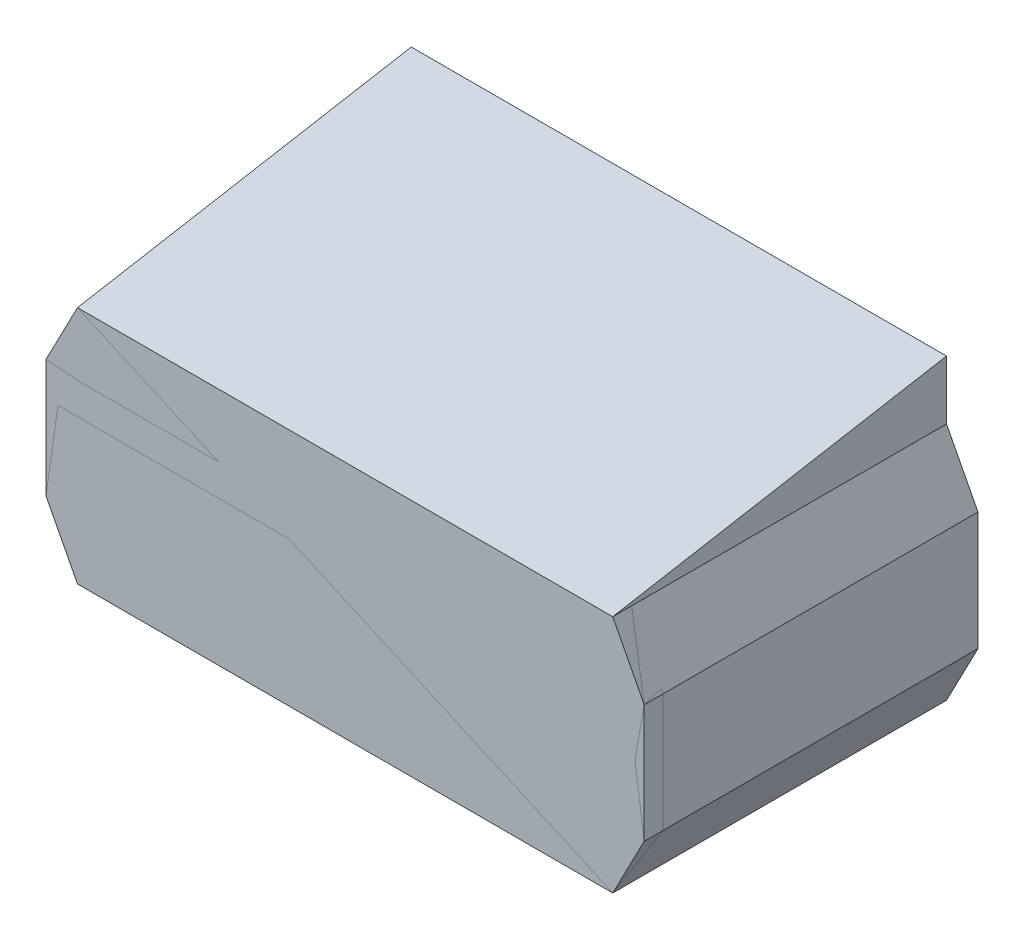
ISO-10303-21;
HEADER;
FILE_DESCRIPTION(('STEP AP214'),'2;1');
FILE_NAME('part.step','',(''),(''),'','','');
FILE_SCHEMA(('AUTOMOTIVE_DESIGN { 1 0 10303 214 1 1 1 1 }'));
ENDSEC;
DATA;
#1=APPLICATION_CONTEXT('core data for automotive mechanical design processes');
#2=APPLICATION_PROTOCOL_DEFINITION('international standard','automotive_design',2000,#1);
#3=PRODUCT_CONTEXT('',#1,'mechanical');
#4=PRODUCT('Part','Part','',(#3));
#5=PRODUCT_RELATED_PRODUCT_CATEGORY('part','',(#4));
#6=PRODUCT_DEFINITION_FORMATION('','',#4);
#7=PRODUCT_DEFINITION_CONTEXT('part definition',#1,'design');
#8=PRODUCT_DEFINITION('design','',#6,#7);
#9=PRODUCT_DEFINITION_SHAPE('','',#8);
#10=(LENGTH_UNIT() NAMED_UNIT(*) SI_UNIT(.MILLI.,.METRE.));
#11=(NAMED_UNIT(*) PLANE_ANGLE_UNIT() SI_UNIT($,.RADIAN.));
#12=(NAMED_UNIT(*) SI_UNIT($,.STERADIAN.) SOLID_ANGLE_UNIT());
#13=UNCERTAINTY_MEASURE_WITH_UNIT(LENGTH_MEASURE(1.E-05),#10,'distance_accuracy_value','');
#14=(GEOMETRIC_REPRESENTATION_CONTEXT(3) GLOBAL_UNCERTAINTY_ASSIGNED_CONTEXT((#13)) GLOBAL_UNIT_ASSIGNED_CONTEXT((#10,
#11,#12)) REPRESENTATION_CONTEXT('',''));
#15=CARTESIAN_POINT('',(0.,0.,0.));
#16=DIRECTION('',(0.,0.,1.));
#17=DIRECTION('',(1.,0.,0.));
#18=AXIS2_PLACEMENT_3D('',#15,#16,#17);
#19=CARTESIAN_POINT('',(-5.,9.60906334512409,-3.));
#20=DIRECTION('',(-1.,0.,0.));
#21=DIRECTION('',(0.,-1.,0.));
#22=AXIS2_PLACEMENT_3D('',#19,#20,#21);
#23=PLANE('',#22);
#24=DIRECTION('',(0.,-1.,0.));
#25=VECTOR('',#24,1.);
#26=CARTESIAN_POINT('',(-5.,9.60906334512409,0.));
#27=LINE('',#26,#25);
#28=CARTESIAN_POINT('',(-5.,28.3909366548759,0.));
#29=VERTEX_POINT('',#28);
#30=CARTESIAN_POINT('',(-5.,9.60906334512409,0.));
#31=VERTEX_POINT('',#30);
#32=EDGE_CURVE('E140',#29,#31,#27,.T.);
#33=ORIENTED_EDGE('',*,*,#32,.F.);
#34=DIRECTION('',(0.,0.,1.));
#35=VECTOR('',#34,1.);
#36=CARTESIAN_POINT('',(-5.,28.3909366548759,-3.));
#37=LINE('',#36,#35);
#38=CARTESIAN_POINT('',(-5.,28.3909366548759,-3.));
#39=VERTEX_POINT('',#38);
#40=EDGE_CURVE('E12',#39,#29,#37,.T.);
#41=ORIENTED_EDGE('',*,*,#40,.F.);
#42=DIRECTION('',(0.,-1.,0.));
#43=VECTOR('',#42,1.);
#44=CARTESIAN_POINT('',(-5.,9.60906334512409,-3.));
#45=LINE('',#44,#43);
#46=CARTESIAN_POINT('',(-5.,9.60906334512409,-3.));
#47=VERTEX_POINT('',#46);
#48=EDGE_CURVE('E160',#39,#47,#45,.T.);
#49=ORIENTED_EDGE('',*,*,#48,.T.);
#50=DIRECTION('',(0.,0.,1.));
#51=VECTOR('',#50,1.);
#52=CARTESIAN_POINT('',(-5.,9.60906334512409,-3.));
#53=LINE('',#52,#51);
#54=EDGE_CURVE('E46',#47,#31,#53,.T.);
#55=ORIENTED_EDGE('',*,*,#54,.T.);
#56=EDGE_LOOP('',(#33,#41,#49,#55));
#57=FACE_BOUND('',#56,.T.);
#58=ADVANCED_FACE('F43',(#57),#23,.T.);
#59=CARTESIAN_POINT('',(-5.,28.3909366548759,-3.));
#60=DIRECTION('',(-0.887092558542106,0.461591586339288,0.));
#61=DIRECTION('',(-0.461591586339288,-0.887092558542106,0.));
#62=AXIS2_PLACEMENT_3D('',#59,#60,#61);
#63=PLANE('',#62);
#64=DIRECTION('',(-0.461591586339288,-0.887092558542106,0.));
#65=VECTOR('',#64,1.);
#66=CARTESIAN_POINT('',(-5.,28.3909366548759,0.));
#67=LINE('',#66,#65);
#68=CARTESIAN_POINT('',(0.,38.,0.));
#69=VERTEX_POINT('',#68);
#70=EDGE_CURVE('E158',#69,#29,#67,.T.);
#71=ORIENTED_EDGE('',*,*,#70,.F.);
#72=DIRECTION('',(0.,0.,1.));
#73=VECTOR('',#72,1.);
#74=CARTESIAN_POINT('',(0.,38.,-3.));
#75=LINE('',#74,#73);
#76=CARTESIAN_POINT('',(0.,38.,-3.));
#77=VERTEX_POINT('',#76);
#78=EDGE_CURVE('E52',#77,#69,#75,.T.);
#79=ORIENTED_EDGE('',*,*,#78,.F.);
#80=DIRECTION('',(-0.461591586339288,-0.887092558542106,0.));
#81=VECTOR('',#80,1.);
#82=CARTESIAN_POINT('',(-5.,28.3909366548759,-3.));
#83=LINE('',#82,#81);
#84=EDGE_CURVE('E130',#77,#39,#83,.T.);
#85=ORIENTED_EDGE('',*,*,#84,.T.);
#86=ORIENTED_EDGE('',*,*,#40,.T.);
#87=EDGE_LOOP('',(#71,#79,#85,#86));
#88=FACE_BOUND('',#87,.T.);
#89=ADVANCED_FACE('F172',(#88),#63,.T.);
#90=CARTESIAN_POINT('',(0.,38.,-3.));
#91=DIRECTION('',(0.,1.,0.));
#92=DIRECTION('',(-1.,0.,0.));
#93=AXIS2_PLACEMENT_3D('',#90,#91,#92);
#94=PLANE('',#93);
#95=DIRECTION('',(-1.,0.,0.));
#96=VECTOR('',#95,1.);
#97=CARTESIAN_POINT('',(0.,38.,0.));
#98=LINE('',#97,#96);
#99=CARTESIAN_POINT('',(85.,38.,0.));
#100=VERTEX_POINT('',#99);
#101=EDGE_CURVE('E117',#100,#69,#98,.T.);
#102=ORIENTED_EDGE('',*,*,#101,.F.);
#103=DIRECTION('',(0.,0.,1.));
#104=VECTOR('',#103,1.);
#105=CARTESIAN_POINT('',(85.,38.,-3.));
#106=LINE('',#105,#104);
#107=CARTESIAN_POINT('',(85.,38.,-3.));
#108=VERTEX_POINT('',#107);
#109=EDGE_CURVE('E112',#108,#100,#106,.T.);
#110=ORIENTED_EDGE('',*,*,#109,.F.);
#111=DIRECTION('',(-1.,0.,0.));
#112=VECTOR('',#111,1.);
#113=CARTESIAN_POINT('',(0.,38.,-3.));
#114=LINE('',#113,#112);
#115=EDGE_CURVE('E115',#108,#77,#114,.T.);
#116=ORIENTED_EDGE('',*,*,#115,.T.);
#117=ORIENTED_EDGE('',*,*,#78,.T.);
#118=EDGE_LOOP('',(#102,#110,#116,#117));
#119=FACE_BOUND('',#118,.T.);
#120=ADVANCED_FACE('F114',(#119),#94,.T.);
#121=CARTESIAN_POINT('',(85.,38.,-3.));
#122=DIRECTION('',(0.887092558542106,0.461591586339288,0.));
#123=DIRECTION('',(-0.461591586339288,0.887092558542106,0.));
#124=AXIS2_PLACEMENT_3D('',#121,#122,#123);
#125=PLANE('',#124);
#126=DIRECTION('',(-0.461591586339288,0.887092558542106,0.));
#127=VECTOR('',#126,1.);
#128=CARTESIAN_POINT('',(85.,38.,0.));
#129=LINE('',#128,#127);
#130=CARTESIAN_POINT('',(90.,28.3909366548759,0.));
#131=VERTEX_POINT('',#130);
#132=EDGE_CURVE('E155',#131,#100,#129,.T.);
#133=ORIENTED_EDGE('',*,*,#132,.F.);
#134=DIRECTION('',(0.,0.,1.));
#135=VECTOR('',#134,1.);
#136=CARTESIAN_POINT('',(90.,28.3909366548759,-3.));
#137=LINE('',#136,#135);
#138=CARTESIAN_POINT('',(90.,28.3909366548759,-3.));
#139=VERTEX_POINT('',#138);
#140=EDGE_CURVE('E122',#139,#131,#137,.T.);
#141=ORIENTED_EDGE('',*,*,#140,.F.);
#142=DIRECTION('',(-0.461591586339288,0.887092558542106,0.));
#143=VECTOR('',#142,1.);
#144=CARTESIAN_POINT('',(85.,38.,-3.));
#145=LINE('',#144,#143);
#146=EDGE_CURVE('E128',#139,#108,#145,.T.);
#147=ORIENTED_EDGE('',*,*,#146,.T.);
#148=ORIENTED_EDGE('',*,*,#109,.T.);
#149=EDGE_LOOP('',(#133,#141,#147,#148));
#150=FACE_BOUND('',#149,.T.);
#151=ADVANCED_FACE('F132',(#150),#125,.T.);
#152=CARTESIAN_POINT('',(90.,28.3909366548759,-3.));
#153=DIRECTION('',(1.,0.,0.));
#154=DIRECTION('',(0.,0.,-1.));
#155=AXIS2_PLACEMENT_3D('',#152,#153,#154);
#156=PLANE('',#155);
#157=DIRECTION('',(0.,1.,0.));
#158=VECTOR('',#157,1.);
#159=CARTESIAN_POINT('',(90.,28.3909366548759,0.));
#160=LINE('',#159,#158);
#161=CARTESIAN_POINT('',(90.,9.60906334512409,0.));
#162=VERTEX_POINT('',#161);
#163=EDGE_CURVE('E152',#162,#131,#160,.T.);
#164=ORIENTED_EDGE('',*,*,#163,.F.);
#165=DIRECTION('',(0.,0.,1.));
#166=VECTOR('',#165,1.);
#167=CARTESIAN_POINT('',(90.,9.60906334512409,-3.));
#168=LINE('',#167,#166);
#169=CARTESIAN_POINT('',(90.,9.60906334512409,-3.));
#170=VERTEX_POINT('',#169);
#171=EDGE_CURVE('E164',#170,#162,#168,.T.);
#172=ORIENTED_EDGE('',*,*,#171,.F.);
#173=DIRECTION('',(0.,1.,0.));
#174=VECTOR('',#173,1.);
#175=CARTESIAN_POINT('',(90.,28.3909366548759,-3.));
#176=LINE('',#175,#174);
#177=EDGE_CURVE('E133',#170,#139,#176,.T.);
#178=ORIENTED_EDGE('',*,*,#177,.T.);
#179=ORIENTED_EDGE('',*,*,#140,.T.);
#180=EDGE_LOOP('',(#164,#172,#178,#179));
#181=FACE_BOUND('',#180,.T.);
#182=ADVANCED_FACE('F185',(#181),#156,.T.);
#183=CARTESIAN_POINT('',(90.,9.60906334512409,-3.));
#184=DIRECTION('',(0.887092558542106,-0.461591586339288,0.));
#185=DIRECTION('',(0.461591586339288,0.887092558542106,0.));
#186=AXIS2_PLACEMENT_3D('',#183,#184,#185);
#187=PLANE('',#186);
#188=DIRECTION('',(0.461591586339288,0.887092558542106,0.));
#189=VECTOR('',#188,1.);
#190=CARTESIAN_POINT('',(90.,9.60906334512409,0.));
#191=LINE('',#190,#189);
#192=CARTESIAN_POINT('',(85.,0.,0.));
#193=VERTEX_POINT('',#192);
#194=EDGE_CURVE('E149',#193,#162,#191,.T.);
#195=ORIENTED_EDGE('',*,*,#194,.F.);
#196=DIRECTION('',(0.,0.,1.));
#197=VECTOR('',#196,1.);
#198=CARTESIAN_POINT('',(85.,0.,-3.));
#199=LINE('',#198,#197);
#200=CARTESIAN_POINT('',(85.,0.,-3.));
#201=VERTEX_POINT('',#200);
#202=EDGE_CURVE('E166',#201,#193,#199,.T.);
#203=ORIENTED_EDGE('',*,*,#202,.F.);
#204=DIRECTION('',(0.461591586339288,0.887092558542106,0.));
#205=VECTOR('',#204,1.);
#206=CARTESIAN_POINT('',(90.,9.60906334512409,-3.));
#207=LINE('',#206,#205);
#208=EDGE_CURVE('E135',#201,#170,#207,.T.);
#209=ORIENTED_EDGE('',*,*,#208,.T.);
#210=ORIENTED_EDGE('',*,*,#171,.T.);
#211=EDGE_LOOP('',(#195,#203,#209,#210));
#212=FACE_BOUND('',#211,.T.);
#213=ADVANCED_FACE('F188',(#212),#187,.T.);
#214=CARTESIAN_POINT('',(85.,0.,-3.));
#215=DIRECTION('',(0.,-1.,0.));
#216=DIRECTION('',(0.,0.,-1.));
#217=AXIS2_PLACEMENT_3D('',#214,#215,#216);
#218=PLANE('',#217);
#219=DIRECTION('',(1.,0.,0.));
#220=VECTOR('',#219,1.);
#221=CARTESIAN_POINT('',(85.,0.,0.));
#222=LINE('',#221,#220);
#223=CARTESIAN_POINT('',(0.,0.,0.));
#224=VERTEX_POINT('',#223);
#225=EDGE_CURVE('E146',#224,#193,#222,.T.);
#226=ORIENTED_EDGE('',*,*,#225,.F.);
#227=DIRECTION('',(0.,0.,1.));
#228=VECTOR('',#227,1.);
#229=CARTESIAN_POINT('',(0.,0.,-3.));
#230=LINE('',#229,#228);
#231=CARTESIAN_POINT('',(0.,0.,-3.));
#232=VERTEX_POINT('',#231);
#233=EDGE_CURVE('E167',#232,#224,#230,.T.);
#234=ORIENTED_EDGE('',*,*,#233,.F.);
#235=DIRECTION('',(1.,0.,0.));
#236=VECTOR('',#235,1.);
#237=CARTESIAN_POINT('',(85.,0.,-3.));
#238=LINE('',#237,#236);
#239=EDGE_CURVE('E263',#232,#201,#238,.T.);
#240=ORIENTED_EDGE('',*,*,#239,.T.);
#241=ORIENTED_EDGE('',*,*,#202,.T.);
#242=EDGE_LOOP('',(#226,#234,#240,#241));
#243=FACE_BOUND('',#242,.T.);
#244=ADVANCED_FACE('F192',(#243),#218,.T.);
#245=CARTESIAN_POINT('',(0.,0.,-3.));
#246=DIRECTION('',(-0.887092558542106,-0.461591586339287,0.));
#247=DIRECTION('',(0.461591586339287,-0.887092558542106,0.));
#248=AXIS2_PLACEMENT_3D('',#245,#246,#247);
#249=PLANE('',#248);
#250=DIRECTION('',(0.461591586339287,-0.887092558542106,0.));
#251=VECTOR('',#250,1.);
#252=CARTESIAN_POINT('',(0.,0.,0.));
#253=LINE('',#252,#251);
#254=EDGE_CURVE('E143',#31,#224,#253,.T.);
#255=ORIENTED_EDGE('',*,*,#254,.F.);
#256=ORIENTED_EDGE('',*,*,#54,.F.);
#257=DIRECTION('',(0.461591586339287,-0.887092558542106,0.));
#258=VECTOR('',#257,1.);
#259=CARTESIAN_POINT('',(0.,0.,-3.));
#260=LINE('',#259,#258);
#261=EDGE_CURVE('E264',#47,#232,#260,.T.);
#262=ORIENTED_EDGE('',*,*,#261,.T.);
#263=ORIENTED_EDGE('',*,*,#233,.T.);
#264=EDGE_LOOP('',(#255,#256,#262,#263));
#265=FACE_BOUND('',#264,.T.);
#266=ADVANCED_FACE('F169',(#265),#249,.T.);
#267=CARTESIAN_POINT('',(0.,0.,-3.));
#268=DIRECTION('',(0.,0.,-1.));
#269=DIRECTION('',(-1.,0.,0.));
#270=AXIS2_PLACEMENT_3D('',#267,#268,#269);
#271=PLANE('',#270);
#272=ORIENTED_EDGE('',*,*,#48,.F.);
#273=ORIENTED_EDGE('',*,*,#84,.F.);
#274=ORIENTED_EDGE('',*,*,#115,.F.);
#275=ORIENTED_EDGE('',*,*,#146,.F.);
#276=ORIENTED_EDGE('',*,*,#177,.F.);
#277=ORIENTED_EDGE('',*,*,#208,.F.);
#278=ORIENTED_EDGE('',*,*,#239,.F.);
#279=ORIENTED_EDGE('',*,*,#261,.F.);
#280=EDGE_LOOP('',(#272,#273,#274,#275,#276,#277,#278,#279));
#281=FACE_BOUND('',#280,.T.);
#282=ADVANCED_FACE('F126',(#281),#271,.T.);
#283=CARTESIAN_POINT('',(0.,0.,0.));
#284=DIRECTION('',(0.,0.,-1.));
#285=DIRECTION('',(-1.,0.,0.));
#286=AXIS2_PLACEMENT_3D('',#283,#284,#285);
#287=PLANE('',#286);
#288=ORIENTED_EDGE('',*,*,#32,.T.);
#289=ORIENTED_EDGE('',*,*,#254,.T.);
#290=ORIENTED_EDGE('',*,*,#225,.T.);
#291=ORIENTED_EDGE('',*,*,#194,.T.);
#292=ORIENTED_EDGE('',*,*,#163,.T.);
#293=ORIENTED_EDGE('',*,*,#132,.T.);
#294=ORIENTED_EDGE('',*,*,#101,.T.);
#295=ORIENTED_EDGE('',*,*,#70,.T.);
#296=EDGE_LOOP('',(#288,#289,#290,#291,#292,#293,#294,#295));
#297=FACE_BOUND('',#296,.T.);
#298=ADVANCED_FACE('F171',(#297),#287,.F.);
#299=CLOSED_SHELL('',(#58,#89,#120,#151,#182,#213,#244,#266,#282,#298));
#300=MANIFOLD_SOLID_BREP('B2',#299);
#301=CARTESIAN_POINT('',(85.,38.,-3.00000000000004));
#302=DIRECTION('',(0.,0.,1.));
#303=DIRECTION('',(1.,0.,0.));
#304=AXIS2_PLACEMENT_3D('',#301,#302,#303);
#305=PLANE('',#304);
#306=DIRECTION('',(0.,-1.,0.));
#307=VECTOR('',#306,1.);
#308=CARTESIAN_POINT('',(3.,38.,-3.00000000000006));
#309=LINE('',#308,#307);
#310=CARTESIAN_POINT('',(3.,35.482701106467,-3.00000000000006));
#311=VERTEX_POINT('',#310);
#312=CARTESIAN_POINT('',(3.,31.,-3.00000000000006));
#313=VERTEX_POINT('',#312);
#314=EDGE_CURVE('E580',#311,#313,#309,.T.);
#315=ORIENTED_EDGE('',*,*,#314,.F.);
#316=DIRECTION('',(1.,0.,0.));
#317=VECTOR('',#316,1.);
#318=CARTESIAN_POINT('',(85.,35.482701106467,-3.00000000000004));
#319=LINE('',#318,#317);
#320=CARTESIAN_POINT('',(82.,35.482701106467,-3.00000000000008));
#321=VERTEX_POINT('',#320);
#322=EDGE_CURVE('E573',#311,#321,#319,.T.);
#323=ORIENTED_EDGE('',*,*,#322,.T.);
#324=DIRECTION('',(0.,-1.,0.));
#325=VECTOR('',#324,1.);
#326=CARTESIAN_POINT('',(82.,38.,-3.00000000000008));
#327=LINE('',#326,#325);
#328=CARTESIAN_POINT('',(82.,31.,-3.00000000000008));
#329=VERTEX_POINT('',#328);
#330=EDGE_CURVE('E577',#321,#329,#327,.T.);
#331=ORIENTED_EDGE('',*,*,#330,.T.);
#332=DIRECTION('',(-0.707106781186549,0.707106781186546,0.));
#333=VECTOR('',#332,1.);
#334=CARTESIAN_POINT('',(80.,33.,-3.00000000000004));
#335=LINE('',#334,#333);
#336=CARTESIAN_POINT('',(85.,28.,-3.00000000000004));
#337=VERTEX_POINT('',#336);
#338=EDGE_CURVE('E473',#329,#337,#335,.F.);
#339=ORIENTED_EDGE('',*,*,#338,.T.);
#340=DIRECTION('',(-1.,0.,0.));
#341=VECTOR('',#340,1.);
#342=CARTESIAN_POINT('',(85.,28.,-3.00000000000004));
#343=LINE('',#342,#341);
#344=CARTESIAN_POINT('',(0.,28.,-3.00000000000003));
#345=VERTEX_POINT('',#344);
#346=EDGE_CURVE('E462',#337,#345,#343,.T.);
#347=ORIENTED_EDGE('',*,*,#346,.T.);
#348=DIRECTION('',(-0.707106781186549,-0.707106781186546,0.));
#349=VECTOR('',#348,1.);
#350=CARTESIAN_POINT('',(47.5000000000002,75.5,-3.00000000000004));
#351=LINE('',#350,#349);
#352=EDGE_CURVE('E470',#345,#313,#351,.F.);
#353=ORIENTED_EDGE('',*,*,#352,.T.);
#354=EDGE_LOOP('',(#315,#323,#331,#339,#347,#353));
#355=FACE_BOUND('',#354,.T.);
#356=ADVANCED_FACE('F271',(#355),#305,.F.);
#357=CARTESIAN_POINT('',(85.,38.,-93.));
#358=DIRECTION('',(-1.,0.,0.));
#359=DIRECTION('',(0.,0.,1.));
#360=AXIS2_PLACEMENT_3D('',#357,#358,#359);
#361=PLANE('',#360);
#362=DIRECTION('',(0.,1.,0.));
#363=VECTOR('',#362,1.);
#364=CARTESIAN_POINT('',(85.,38.,-53.));
#365=LINE('',#364,#363);
#366=CARTESIAN_POINT('',(85.,26.1,-53.));
#367=VERTEX_POINT('',#366);
#368=CARTESIAN_POINT('',(85.,28.,-53.));
#369=VERTEX_POINT('',#368);
#370=EDGE_CURVE('E542',#367,#369,#365,.T.);
#371=ORIENTED_EDGE('',*,*,#370,.F.);
#372=DIRECTION('',(0.,0.,1.));
#373=VECTOR('',#372,1.);
#374=CARTESIAN_POINT('',(85.,26.1,-93.));
#375=LINE('',#374,#373);
#376=CARTESIAN_POINT('',(85.,26.1,0.));
#377=VERTEX_POINT('',#376);
#378=EDGE_CURVE('E616',#367,#377,#375,.T.);
#379=ORIENTED_EDGE('',*,*,#378,.T.);
#380=DIRECTION('',(0.,1.,0.));
#381=VECTOR('',#380,1.);
#382=CARTESIAN_POINT('',(85.,26.,0.));
#383=LINE('',#382,#381);
#384=CARTESIAN_POINT('',(85.,28.,0.));
#385=VERTEX_POINT('',#384);
#386=EDGE_CURVE('E585',#377,#385,#383,.T.);
#387=ORIENTED_EDGE('',*,*,#386,.T.);
#388=DIRECTION('',(0.,0.,1.));
#389=VECTOR('',#388,1.);
#390=CARTESIAN_POINT('',(85.,28.,-10.));
#391=LINE('',#390,#389);
#392=EDGE_CURVE('E591',#337,#385,#391,.T.);
#393=ORIENTED_EDGE('',*,*,#392,.F.);
#394=EDGE_CURVE('E596',#369,#337,#391,.T.);
#395=ORIENTED_EDGE('',*,*,#394,.F.);
#396=EDGE_LOOP('',(#371,#379,#387,#393,#395));
#397=FACE_BOUND('',#396,.T.);
#398=ADVANCED_FACE('F657',(#397),#361,.T.);
#399=CARTESIAN_POINT('',(0.,38.,-93.));
#400=DIRECTION('',(1.,0.,0.));
#401=DIRECTION('',(0.,1.,0.));
#402=AXIS2_PLACEMENT_3D('',#399,#400,#401);
#403=PLANE('',#402);
#404=DIRECTION('',(0.,-1.,0.));
#405=VECTOR('',#404,1.);
#406=CARTESIAN_POINT('',(0.,38.,-53.));
#407=LINE('',#406,#405);
#408=CARTESIAN_POINT('',(0.,28.,-53.));
#409=VERTEX_POINT('',#408);
#410=CARTESIAN_POINT('',(0.,26.1,-53.));
#411=VERTEX_POINT('',#410);
#412=EDGE_CURVE('E540',#409,#411,#407,.T.);
#413=ORIENTED_EDGE('',*,*,#412,.F.);
#414=DIRECTION('',(0.,0.,1.));
#415=VECTOR('',#414,1.);
#416=CARTESIAN_POINT('',(0.,28.,-10.));
#417=LINE('',#416,#415);
#418=EDGE_CURVE('E592',#409,#345,#417,.T.);
#419=ORIENTED_EDGE('',*,*,#418,.T.);
#420=CARTESIAN_POINT('',(0.,28.,0.));
#421=VERTEX_POINT('',#420);
#422=EDGE_CURVE('E595',#345,#421,#417,.T.);
#423=ORIENTED_EDGE('',*,*,#422,.T.);
#424=DIRECTION('',(0.,-1.,0.));
#425=VECTOR('',#424,1.);
#426=CARTESIAN_POINT('',(0.,26.,0.));
#427=LINE('',#426,#425);
#428=CARTESIAN_POINT('',(0.,26.1,0.));
#429=VERTEX_POINT('',#428);
#430=EDGE_CURVE('E582',#421,#429,#427,.T.);
#431=ORIENTED_EDGE('',*,*,#430,.T.);
#432=DIRECTION('',(0.,0.,1.));
#433=VECTOR('',#432,1.);
#434=CARTESIAN_POINT('',(0.,26.1,-93.));
#435=LINE('',#434,#433);
#436=EDGE_CURVE('E612',#411,#429,#435,.T.);
#437=ORIENTED_EDGE('',*,*,#436,.F.);
#438=EDGE_LOOP('',(#413,#419,#423,#431,#437));
#439=FACE_BOUND('',#438,.T.);
#440=ADVANCED_FACE('F663',(#439),#403,.T.);
#441=DIRECTION('',(0.,-1.,0.));
#442=VECTOR('',#441,1.);
#443=CARTESIAN_POINT('',(0.,38.,-53.));
#444=LINE('',#443,#442);
#445=CARTESIAN_POINT('',(0.,23.,-53.));
#446=VERTEX_POINT('',#445);
#447=CARTESIAN_POINT('',(0.,3.,-53.));
#448=VERTEX_POINT('',#447);
#449=EDGE_CURVE('E554',#446,#448,#444,.T.);
#450=ORIENTED_EDGE('',*,*,#449,.F.);
#451=DIRECTION('',(0.,0.,1.));
#452=VECTOR('',#451,1.);
#453=CARTESIAN_POINT('',(0.,23.,-93.));
#454=LINE('',#453,#452);
#455=CARTESIAN_POINT('',(0.,23.,-3.));
#456=VERTEX_POINT('',#455);
#457=EDGE_CURVE('E614',#446,#456,#454,.T.);
#458=ORIENTED_EDGE('',*,*,#457,.T.);
#459=DIRECTION('',(0.,-1.,0.));
#460=VECTOR('',#459,1.);
#461=CARTESIAN_POINT('',(0.,23.,-3.));
#462=LINE('',#461,#460);
#463=CARTESIAN_POINT('',(0.,3.,-3.));
#464=VERTEX_POINT('',#463);
#465=EDGE_CURVE('E594',#456,#464,#462,.T.);
#466=ORIENTED_EDGE('',*,*,#465,.T.);
#467=DIRECTION('',(0.,0.,1.));
#468=VECTOR('',#467,1.);
#469=CARTESIAN_POINT('',(0.,3.,0.));
#470=LINE('',#469,#468);
#471=EDGE_CURVE('E454',#448,#464,#470,.T.);
#472=ORIENTED_EDGE('',*,*,#471,.F.);
#473=EDGE_LOOP('',(#450,#458,#466,#472));
#474=FACE_BOUND('',#473,.T.);
#475=ADVANCED_FACE('F703',(#474),#403,.T.);
#476=CARTESIAN_POINT('',(0.,3.,0.));
#477=DIRECTION('',(0.,-1.,0.));
#478=DIRECTION('',(0.,0.,-1.));
#479=AXIS2_PLACEMENT_3D('',#476,#477,#478);
#480=PLANE('',#479);
#481=DIRECTION('',(0.,0.,-1.));
#482=VECTOR('',#481,1.);
#483=CARTESIAN_POINT('',(85.,3.,0.));
#484=LINE('',#483,#482);
#485=CARTESIAN_POINT('',(85.,3.,-3.));
#486=VERTEX_POINT('',#485);
#487=CARTESIAN_POINT('',(85.,3.,-53.));
#488=VERTEX_POINT('',#487);
#489=EDGE_CURVE('E457',#486,#488,#484,.T.);
#490=ORIENTED_EDGE('',*,*,#489,.T.);
#491=DIRECTION('',(-1.,0.,0.));
#492=VECTOR('',#491,1.);
#493=CARTESIAN_POINT('',(0.,3.,-53.));
#494=LINE('',#493,#492);
#495=EDGE_CURVE('E558',#488,#448,#494,.T.);
#496=ORIENTED_EDGE('',*,*,#495,.T.);
#497=ORIENTED_EDGE('',*,*,#471,.T.);
#498=DIRECTION('',(1.,0.,0.));
#499=VECTOR('',#498,1.);
#500=CARTESIAN_POINT('',(0.,3.,-3.));
#501=LINE('',#500,#499);
#502=EDGE_CURVE('E600',#464,#486,#501,.T.);
#503=ORIENTED_EDGE('',*,*,#502,.T.);
#504=EDGE_LOOP('',(#490,#496,#497,#503));
#505=FACE_BOUND('',#504,.T.);
#506=ADVANCED_FACE('F689',(#505),#480,.F.);
#507=DIRECTION('',(0.,1.,0.));
#508=VECTOR('',#507,1.);
#509=CARTESIAN_POINT('',(85.,38.,-53.));
#510=LINE('',#509,#508);
#511=CARTESIAN_POINT('',(85.,23.,-53.));
#512=VERTEX_POINT('',#511);
#513=EDGE_CURVE('E556',#488,#512,#510,.T.);
#514=ORIENTED_EDGE('',*,*,#513,.F.);
#515=ORIENTED_EDGE('',*,*,#489,.F.);
#516=DIRECTION('',(0.,1.,0.));
#517=VECTOR('',#516,1.);
#518=CARTESIAN_POINT('',(85.,23.,-3.));
#519=LINE('',#518,#517);
#520=CARTESIAN_POINT('',(85.,23.,-3.));
#521=VERTEX_POINT('',#520);
#522=EDGE_CURVE('E602',#486,#521,#519,.T.);
#523=ORIENTED_EDGE('',*,*,#522,.T.);
#524=DIRECTION('',(0.,0.,1.));
#525=VECTOR('',#524,1.);
#526=CARTESIAN_POINT('',(85.,23.,-93.));
#527=LINE('',#526,#525);
#528=EDGE_CURVE('E608',#512,#521,#527,.T.);
#529=ORIENTED_EDGE('',*,*,#528,.F.);
#530=EDGE_LOOP('',(#514,#515,#523,#529));
#531=FACE_BOUND('',#530,.T.);
#532=ADVANCED_FACE('F666',(#531),#361,.T.);
#533=CARTESIAN_POINT('',(0.,3.,0.));
#534=DIRECTION('',(0.,0.,-1.));
#535=DIRECTION('',(-1.,0.,0.));
#536=AXIS2_PLACEMENT_3D('',#533,#534,#535);
#537=PLANE('',#536);
#538=DIRECTION('',(0.707106781186548,0.707106781186547,0.));
#539=VECTOR('',#538,1.);
#540=CARTESIAN_POINT('',(-11.55,14.55,0.));
#541=LINE('',#540,#539);
#542=CARTESIAN_POINT('',(-3.1,23.,0.));
#543=VERTEX_POINT('',#542);
#544=EDGE_CURVE('E623',#543,#429,#541,.T.);
#545=ORIENTED_EDGE('',*,*,#544,.T.);
#546=ORIENTED_EDGE('',*,*,#430,.F.);
#547=DIRECTION('',(-1.,0.,0.));
#548=VECTOR('',#547,1.);
#549=CARTESIAN_POINT('',(0.,28.,0.));
#550=LINE('',#549,#548);
#551=EDGE_CURVE('E588',#385,#421,#550,.T.);
#552=ORIENTED_EDGE('',*,*,#551,.F.);
#553=ORIENTED_EDGE('',*,*,#386,.F.);
#554=DIRECTION('',(0.707106781186547,-0.707106781186548,0.));
#555=VECTOR('',#554,1.);
#556=CARTESIAN_POINT('',(54.0500000000001,57.05,0.));
#557=LINE('',#556,#555);
#558=CARTESIAN_POINT('',(88.1,23.,0.));
#559=VERTEX_POINT('',#558);
#560=EDGE_CURVE('E611',#377,#559,#557,.T.);
#561=ORIENTED_EDGE('',*,*,#560,.T.);
#562=DIRECTION('',(-1.,0.,0.));
#563=VECTOR('',#562,1.);
#564=CARTESIAN_POINT('',(0.,23.,0.));
#565=LINE('',#564,#563);
#566=EDGE_CURVE('E626',#559,#543,#565,.T.);
#567=ORIENTED_EDGE('',*,*,#566,.T.);
#568=EDGE_LOOP('',(#545,#546,#552,#553,#561,#567));
#569=FACE_BOUND('',#568,.T.);
#570=DIRECTION('',(-0.461591586339288,0.887092558542106,0.));
#571=VECTOR('',#570,1.);
#572=CARTESIAN_POINT('',(90.,28.3909366548759,0.));
#573=LINE('',#572,#571);
#574=CARTESIAN_POINT('',(90.,28.3909366548759,0.));
#575=VERTEX_POINT('',#574);
#576=CARTESIAN_POINT('',(85.,38.,0.));
#577=VERTEX_POINT('',#576);
#578=EDGE_CURVE('E501',#575,#577,#573,.T.);
#579=ORIENTED_EDGE('',*,*,#578,.T.);
#580=DIRECTION('',(-1.,0.,0.));
#581=VECTOR('',#580,1.);
#582=CARTESIAN_POINT('',(0.,37.9999999999988,0.));
#583=LINE('',#582,#581);
#584=CARTESIAN_POINT('',(0.,38.,0.));
#585=VERTEX_POINT('',#584);
#586=EDGE_CURVE('E479',#577,#585,#583,.T.);
#587=ORIENTED_EDGE('',*,*,#586,.T.);
#588=DIRECTION('',(-0.461591586339287,-0.887092558542106,0.));
#589=VECTOR('',#588,1.);
#590=CARTESIAN_POINT('',(-5.,28.3909366548759,0.));
#591=LINE('',#590,#589);
#592=CARTESIAN_POINT('',(-5.,28.3909366548759,0.));
#593=VERTEX_POINT('',#592);
#594=EDGE_CURVE('E497',#585,#593,#591,.T.);
#595=ORIENTED_EDGE('',*,*,#594,.T.);
#596=DIRECTION('',(0.,-1.,0.));
#597=VECTOR('',#596,1.);
#598=CARTESIAN_POINT('',(-5.,9.60906334512409,0.));
#599=LINE('',#598,#597);
#600=CARTESIAN_POINT('',(-5.,9.60906334512409,0.));
#601=VERTEX_POINT('',#600);
#602=EDGE_CURVE('E507',#593,#601,#599,.T.);
#603=ORIENTED_EDGE('',*,*,#602,.T.);
#604=DIRECTION('',(0.461591586339287,-0.887092558542106,0.));
#605=VECTOR('',#604,1.);
#606=CARTESIAN_POINT('',(0.,0.,0.));
#607=LINE('',#606,#605);
#608=CARTESIAN_POINT('',(0.,0.,0.));
#609=VERTEX_POINT('',#608);
#610=EDGE_CURVE('E508',#601,#609,#607,.T.);
#611=ORIENTED_EDGE('',*,*,#610,.T.);
#612=DIRECTION('',(1.,0.,0.));
#613=VECTOR('',#612,1.);
#614=CARTESIAN_POINT('',(0.,0.,0.));
#615=LINE('',#614,#613);
#616=CARTESIAN_POINT('',(85.,0.,0.));
#617=VERTEX_POINT('',#616);
#618=EDGE_CURVE('E455',#609,#617,#615,.T.);
#619=ORIENTED_EDGE('',*,*,#618,.T.);
#620=DIRECTION('',(0.461591586339288,0.887092558542106,0.));
#621=VECTOR('',#620,1.);
#622=CARTESIAN_POINT('',(85.,0.,0.));
#623=LINE('',#622,#621);
#624=CARTESIAN_POINT('',(90.,9.60906334512409,0.));
#625=VERTEX_POINT('',#624);
#626=EDGE_CURVE('E452',#617,#625,#623,.T.);
#627=ORIENTED_EDGE('',*,*,#626,.T.);
#628=DIRECTION('',(0.,1.,0.));
#629=VECTOR('',#628,1.);
#630=CARTESIAN_POINT('',(90.,9.60906334512409,0.));
#631=LINE('',#630,#629);
#632=EDGE_CURVE('E630',#625,#575,#631,.T.);
#633=ORIENTED_EDGE('',*,*,#632,.T.);
#634=EDGE_LOOP('',(#579,#587,#595,#603,#611,#619,#627,#633));
#635=FACE_BOUND('',#634,.T.);
#636=ADVANCED_FACE('F495',(#569,#635),#537,.F.);
#637=CARTESIAN_POINT('',(0.,0.,0.));
#638=DIRECTION('',(0.,-1.,0.));
#639=DIRECTION('',(0.,0.,-1.));
#640=AXIS2_PLACEMENT_3D('',#637,#638,#639);
#641=PLANE('',#640);
#642=DIRECTION('',(-1.,0.,0.));
#643=VECTOR('',#642,1.);
#644=CARTESIAN_POINT('',(-5.,0.,-53.));
#645=LINE('',#644,#643);
#646=CARTESIAN_POINT('',(85.,0.,-53.));
#647=VERTEX_POINT('',#646);
#648=CARTESIAN_POINT('',(0.,0.,-53.));
#649=VERTEX_POINT('',#648);
#650=EDGE_CURVE('E432',#647,#649,#645,.T.);
#651=ORIENTED_EDGE('',*,*,#650,.F.);
#652=DIRECTION('',(0.,0.,-1.));
#653=VECTOR('',#652,1.);
#654=CARTESIAN_POINT('',(85.,0.,0.));
#655=LINE('',#654,#653);
#656=EDGE_CURVE('E447',#617,#647,#655,.T.);
#657=ORIENTED_EDGE('',*,*,#656,.F.);
#658=ORIENTED_EDGE('',*,*,#618,.F.);
#659=DIRECTION('',(0.,0.,1.));
#660=VECTOR('',#659,1.);
#661=CARTESIAN_POINT('',(0.,0.,0.));
#662=LINE('',#661,#660);
#663=EDGE_CURVE('E448',#649,#609,#662,.T.);
#664=ORIENTED_EDGE('',*,*,#663,.F.);
#665=EDGE_LOOP('',(#651,#657,#658,#664));
#666=FACE_BOUND('',#665,.T.);
#667=ADVANCED_FACE('F445',(#666),#641,.T.);
#668=CARTESIAN_POINT('',(0.,0.,-93.));
#669=DIRECTION('',(-0.887092558542106,-0.461591586339287,0.));
#670=DIRECTION('',(0.461591586339287,-0.887092558542106,0.));
#671=AXIS2_PLACEMENT_3D('',#668,#669,#670);
#672=PLANE('',#671);
#673=DIRECTION('',(-0.461591586339287,0.887092558542106,0.));
#674=VECTOR('',#673,1.);
#675=CARTESIAN_POINT('',(0.,0.,-53.));
#676=LINE('',#675,#674);
#677=CARTESIAN_POINT('',(-5.,9.6090633451241,-53.));
#678=VERTEX_POINT('',#677);
#679=EDGE_CURVE('E439',#649,#678,#676,.T.);
#680=ORIENTED_EDGE('',*,*,#679,.F.);
#681=ORIENTED_EDGE('',*,*,#663,.T.);
#682=ORIENTED_EDGE('',*,*,#610,.F.);
#683=DIRECTION('',(0.,0.,1.));
#684=VECTOR('',#683,1.);
#685=CARTESIAN_POINT('',(-5.,9.60906334512409,-93.));
#686=LINE('',#685,#684);
#687=EDGE_CURVE('E516',#678,#601,#686,.T.);
#688=ORIENTED_EDGE('',*,*,#687,.F.);
#689=EDGE_LOOP('',(#680,#681,#682,#688));
#690=FACE_BOUND('',#689,.T.);
#691=ADVANCED_FACE('F523',(#690),#672,.T.);
#692=CARTESIAN_POINT('',(-5.,9.60906334512409,-93.));
#693=DIRECTION('',(-1.,0.,0.));
#694=DIRECTION('',(0.,-1.,0.));
#695=AXIS2_PLACEMENT_3D('',#692,#693,#694);
#696=PLANE('',#695);
#697=DIRECTION('',(0.,-1.,0.));
#698=VECTOR('',#697,1.);
#699=CARTESIAN_POINT('',(-5.,54.3984092058858,-53.));
#700=LINE('',#699,#698);
#701=CARTESIAN_POINT('',(-4.99999999999999,28.3909366548759,-53.));
#702=VERTEX_POINT('',#701);
#703=EDGE_CURVE('E528',#702,#678,#700,.T.);
#704=ORIENTED_EDGE('',*,*,#703,.T.);
#705=ORIENTED_EDGE('',*,*,#687,.T.);
#706=ORIENTED_EDGE('',*,*,#602,.F.);
#707=DIRECTION('',(0.,0.,1.));
#708=VECTOR('',#707,1.);
#709=CARTESIAN_POINT('',(-5.,28.3909366548759,-93.));
#710=LINE('',#709,#708);
#711=EDGE_CURVE('E506',#702,#593,#710,.T.);
#712=ORIENTED_EDGE('',*,*,#711,.F.);
#713=EDGE_LOOP('',(#704,#705,#706,#712));
#714=FACE_BOUND('',#713,.T.);
#715=ADVANCED_FACE('F527',(#714),#696,.T.);
#716=CARTESIAN_POINT('',(-5.,28.3909366548759,-93.));
#717=DIRECTION('',(-0.887092558542106,0.461591586339287,0.));
#718=DIRECTION('',(-0.461591586339287,-0.887092558542106,0.));
#719=AXIS2_PLACEMENT_3D('',#716,#717,#718);
#720=PLANE('',#719);
#721=DIRECTION('',(0.461591586339287,0.887092558542106,0.));
#722=VECTOR('',#721,1.);
#723=CARTESIAN_POINT('',(-5.,28.3909366548759,-53.));
#724=LINE('',#723,#722);
#725=CARTESIAN_POINT('',(0.,38.,-53.));
#726=VERTEX_POINT('',#725);
#727=EDGE_CURVE('E440',#702,#726,#724,.T.);
#728=ORIENTED_EDGE('',*,*,#727,.F.);
#729=ORIENTED_EDGE('',*,*,#711,.T.);
#730=ORIENTED_EDGE('',*,*,#594,.F.);
#731=DIRECTION('',(0.,0.,1.));
#732=VECTOR('',#731,1.);
#733=CARTESIAN_POINT('',(0.,38.,-93.));
#734=LINE('',#733,#732);
#735=EDGE_CURVE('E486',#726,#585,#734,.T.);
#736=ORIENTED_EDGE('',*,*,#735,.F.);
#737=EDGE_LOOP('',(#728,#729,#730,#736));
#738=FACE_BOUND('',#737,.T.);
#739=ADVANCED_FACE('F504',(#738),#720,.T.);
#740=CARTESIAN_POINT('',(85.,0.,-93.));
#741=DIRECTION('',(0.887092558542106,-0.461591586339288,0.));
#742=DIRECTION('',(0.461591586339288,0.887092558542106,0.));
#743=AXIS2_PLACEMENT_3D('',#740,#741,#742);
#744=PLANE('',#743);
#745=DIRECTION('',(-0.461591586339288,-0.887092558542106,0.));
#746=VECTOR('',#745,1.);
#747=CARTESIAN_POINT('',(85.,0.,-53.));
#748=LINE('',#747,#746);
#749=CARTESIAN_POINT('',(90.,9.6090633451241,-53.));
#750=VERTEX_POINT('',#749);
#751=EDGE_CURVE('E429',#750,#647,#748,.T.);
#752=ORIENTED_EDGE('',*,*,#751,.F.);
#753=DIRECTION('',(0.,0.,1.));
#754=VECTOR('',#753,1.);
#755=CARTESIAN_POINT('',(90.,9.60906334512409,-93.));
#756=LINE('',#755,#754);
#757=EDGE_CURVE('E633',#750,#625,#756,.T.);
#758=ORIENTED_EDGE('',*,*,#757,.T.);
#759=ORIENTED_EDGE('',*,*,#626,.F.);
#760=ORIENTED_EDGE('',*,*,#656,.T.);
#761=EDGE_LOOP('',(#752,#758,#759,#760));
#762=FACE_BOUND('',#761,.T.);
#763=ADVANCED_FACE('F450',(#762),#744,.T.);
#764=CARTESIAN_POINT('',(90.,28.3909366548759,-93.));
#765=DIRECTION('',(0.887092558542106,0.461591586339288,0.));
#766=DIRECTION('',(-0.461591586339288,0.887092558542106,0.));
#767=AXIS2_PLACEMENT_3D('',#764,#765,#766);
#768=PLANE('',#767);
#769=DIRECTION('',(0.461591586339288,-0.887092558542106,0.));
#770=VECTOR('',#769,1.);
#771=CARTESIAN_POINT('',(90.,28.3909366548759,-53.));
#772=LINE('',#771,#770);
#773=CARTESIAN_POINT('',(85.,38.,-53.));
#774=VERTEX_POINT('',#773);
#775=CARTESIAN_POINT('',(90.,28.3909366548759,-53.));
#776=VERTEX_POINT('',#775);
#777=EDGE_CURVE('E566',#774,#776,#772,.T.);
#778=ORIENTED_EDGE('',*,*,#777,.F.);
#779=DIRECTION('',(0.,0.,1.));
#780=VECTOR('',#779,1.);
#781=CARTESIAN_POINT('',(85.,38.,-93.));
#782=LINE('',#781,#780);
#783=EDGE_CURVE('E512',#774,#577,#782,.T.);
#784=ORIENTED_EDGE('',*,*,#783,.T.);
#785=ORIENTED_EDGE('',*,*,#578,.F.);
#786=DIRECTION('',(0.,0.,1.));
#787=VECTOR('',#786,1.);
#788=CARTESIAN_POINT('',(90.,28.3909366548759,-93.));
#789=LINE('',#788,#787);
#790=EDGE_CURVE('E635',#776,#575,#789,.T.);
#791=ORIENTED_EDGE('',*,*,#790,.F.);
#792=EDGE_LOOP('',(#778,#784,#785,#791));
#793=FACE_BOUND('',#792,.T.);
#794=ADVANCED_FACE('F642',(#793),#768,.T.);
#795=CARTESIAN_POINT('',(90.,9.60906334512409,-93.));
#796=DIRECTION('',(1.,0.,0.));
#797=DIRECTION('',(0.,0.,-1.));
#798=AXIS2_PLACEMENT_3D('',#795,#796,#797);
#799=PLANE('',#798);
#800=DIRECTION('',(0.,-1.,0.));
#801=VECTOR('',#800,1.);
#802=CARTESIAN_POINT('',(90.,54.3984092058858,-53.));
#803=LINE('',#802,#801);
#804=EDGE_CURVE('E435',#776,#750,#803,.T.);
#805=ORIENTED_EDGE('',*,*,#804,.F.);
#806=ORIENTED_EDGE('',*,*,#790,.T.);
#807=ORIENTED_EDGE('',*,*,#632,.F.);
#808=ORIENTED_EDGE('',*,*,#757,.F.);
#809=EDGE_LOOP('',(#805,#806,#807,#808));
#810=FACE_BOUND('',#809,.T.);
#811=ADVANCED_FACE('F638',(#810),#799,.T.);
#812=CARTESIAN_POINT('',(88.1,23.,-93.));
#813=DIRECTION('',(0.707106781186548,0.707106781186547,0.));
#814=DIRECTION('',(-0.707106781186547,0.707106781186548,0.));
#815=AXIS2_PLACEMENT_3D('',#812,#813,#814);
#816=PLANE('',#815);
#817=ORIENTED_EDGE('',*,*,#378,.F.);
#818=DIRECTION('',(0.707106781186547,-0.707106781186548,0.));
#819=VECTOR('',#818,1.);
#820=CARTESIAN_POINT('',(88.1,23.,-53.));
#821=LINE('',#820,#819);
#822=CARTESIAN_POINT('',(88.1,23.,-53.));
#823=VERTEX_POINT('',#822);
#824=EDGE_CURVE('E550',#367,#823,#821,.T.);
#825=ORIENTED_EDGE('',*,*,#824,.T.);
#826=DIRECTION('',(0.,0.,1.));
#827=VECTOR('',#826,1.);
#828=CARTESIAN_POINT('',(88.1,23.,-93.));
#829=LINE('',#828,#827);
#830=EDGE_CURVE('E618',#823,#559,#829,.T.);
#831=ORIENTED_EDGE('',*,*,#830,.T.);
#832=ORIENTED_EDGE('',*,*,#560,.F.);
#833=EDGE_LOOP('',(#817,#825,#831,#832));
#834=FACE_BOUND('',#833,.T.);
#835=ADVANCED_FACE('F683',(#834),#816,.F.);
#836=CARTESIAN_POINT('',(0.,23.,-93.));
#837=DIRECTION('',(0.,-1.,0.));
#838=DIRECTION('',(0.,0.,-1.));
#839=AXIS2_PLACEMENT_3D('',#836,#837,#838);
#840=PLANE('',#839);
#841=ORIENTED_EDGE('',*,*,#830,.F.);
#842=DIRECTION('',(-1.,0.,0.));
#843=VECTOR('',#842,1.);
#844=CARTESIAN_POINT('',(0.,23.,-53.));
#845=LINE('',#844,#843);
#846=EDGE_CURVE('E551',#823,#512,#845,.T.);
#847=ORIENTED_EDGE('',*,*,#846,.T.);
#848=ORIENTED_EDGE('',*,*,#528,.T.);
#849=DIRECTION('',(-1.,0.,0.));
#850=VECTOR('',#849,1.);
#851=CARTESIAN_POINT('',(0.,23.,-3.));
#852=LINE('',#851,#850);
#853=EDGE_CURVE('E605',#521,#456,#852,.T.);
#854=ORIENTED_EDGE('',*,*,#853,.T.);
#855=ORIENTED_EDGE('',*,*,#457,.F.);
#856=CARTESIAN_POINT('',(-3.1,23.,-53.));
#857=VERTEX_POINT('',#856);
#858=EDGE_CURVE('E547',#446,#857,#845,.T.);
#859=ORIENTED_EDGE('',*,*,#858,.T.);
#860=DIRECTION('',(0.,0.,1.));
#861=VECTOR('',#860,1.);
#862=CARTESIAN_POINT('',(-3.1,23.,-93.));
#863=LINE('',#862,#861);
#864=EDGE_CURVE('E609',#857,#543,#863,.T.);
#865=ORIENTED_EDGE('',*,*,#864,.T.);
#866=ORIENTED_EDGE('',*,*,#566,.F.);
#867=EDGE_LOOP('',(#841,#847,#848,#854,#855,#859,#865,#866));
#868=FACE_BOUND('',#867,.T.);
#869=ADVANCED_FACE('F679',(#868),#840,.F.);
#870=CARTESIAN_POINT('',(-3.1,23.,-93.));
#871=DIRECTION('',(-0.707106781186547,0.707106781186548,0.));
#872=DIRECTION('',(-0.707106781186548,-0.707106781186547,0.));
#873=AXIS2_PLACEMENT_3D('',#870,#871,#872);
#874=PLANE('',#873);
#875=ORIENTED_EDGE('',*,*,#864,.F.);
#876=DIRECTION('',(0.707106781186548,0.707106781186547,0.));
#877=VECTOR('',#876,1.);
#878=CARTESIAN_POINT('',(-3.1,23.,-53.));
#879=LINE('',#878,#877);
#880=EDGE_CURVE('E544',#857,#411,#879,.T.);
#881=ORIENTED_EDGE('',*,*,#880,.T.);
#882=ORIENTED_EDGE('',*,*,#436,.T.);
#883=ORIENTED_EDGE('',*,*,#544,.F.);
#884=EDGE_LOOP('',(#875,#881,#882,#883));
#885=FACE_BOUND('',#884,.T.);
#886=ADVANCED_FACE('F675',(#885),#874,.F.);
#887=CARTESIAN_POINT('',(0.,0.,-3.));
#888=DIRECTION('',(0.,0.,1.));
#889=DIRECTION('',(1.,0.,0.));
#890=AXIS2_PLACEMENT_3D('',#887,#888,#889);
#891=PLANE('',#890);
#892=ORIENTED_EDGE('',*,*,#465,.F.);
#893=ORIENTED_EDGE('',*,*,#853,.F.);
#894=ORIENTED_EDGE('',*,*,#522,.F.);
#895=ORIENTED_EDGE('',*,*,#502,.F.);
#896=EDGE_LOOP('',(#892,#893,#894,#895));
#897=FACE_BOUND('',#896,.T.);
#898=ADVANCED_FACE('F672',(#897),#891,.F.);
#899=CARTESIAN_POINT('',(0.,28.,-10.));
#900=DIRECTION('',(0.,1.,0.));
#901=DIRECTION('',(0.,0.,1.));
#902=AXIS2_PLACEMENT_3D('',#899,#900,#901);
#903=PLANE('',#902);
#904=ORIENTED_EDGE('',*,*,#422,.F.);
#905=ORIENTED_EDGE('',*,*,#346,.F.);
#906=ORIENTED_EDGE('',*,*,#392,.T.);
#907=ORIENTED_EDGE('',*,*,#551,.T.);
#908=EDGE_LOOP('',(#904,#905,#906,#907));
#909=FACE_BOUND('',#908,.T.);
#910=ADVANCED_FACE('F670',(#909),#903,.F.);
#911=CARTESIAN_POINT('',(3.,38.,-3.00000000000006));
#912=DIRECTION('',(-1.,0.,0.));
#913=DIRECTION('',(0.,0.,1.));
#914=AXIS2_PLACEMENT_3D('',#911,#912,#913);
#915=PLANE('',#914);
#916=DIRECTION('',(0.,0.,-1.));
#917=VECTOR('',#916,1.);
#918=CARTESIAN_POINT('',(3.,31.,-3.00000000000006));
#919=LINE('',#918,#917);
#920=CARTESIAN_POINT('',(3.,31.,-53.));
#921=VERTEX_POINT('',#920);
#922=EDGE_CURVE('E465',#313,#921,#919,.T.);
#923=ORIENTED_EDGE('',*,*,#922,.T.);
#924=DIRECTION('',(0.,1.,0.));
#925=VECTOR('',#924,1.);
#926=CARTESIAN_POINT('',(3.,38.,-53.));
#927=LINE('',#926,#925);
#928=CARTESIAN_POINT('',(3.,44.2990501418901,-53.));
#929=VERTEX_POINT('',#928);
#930=EDGE_CURVE('E530',#921,#929,#927,.T.);
#931=ORIENTED_EDGE('',*,*,#930,.T.);
#932=DIRECTION('',(0.,-0.173648177666927,0.984807753012209));
#933=VECTOR('',#932,1.);
#934=CARTESIAN_POINT('',(3.,35.5586069559507,-3.43048346417991));
#935=LINE('',#934,#933);
#936=EDGE_CURVE('E575',#929,#311,#935,.T.);
#937=ORIENTED_EDGE('',*,*,#936,.T.);
#938=ORIENTED_EDGE('',*,*,#314,.T.);
#939=EDGE_LOOP('',(#923,#931,#937,#938));
#940=FACE_BOUND('',#939,.T.);
#941=ADVANCED_FACE('F745',(#940),#915,.F.);
#942=CARTESIAN_POINT('',(82.,38.,-3.00000000000008));
#943=DIRECTION('',(1.,0.,0.));
#944=DIRECTION('',(0.,0.,-1.));
#945=AXIS2_PLACEMENT_3D('',#942,#943,#944);
#946=PLANE('',#945);
#947=DIRECTION('',(0.,0.173648177666927,-0.984807753012209));
#948=VECTOR('',#947,1.);
#949=CARTESIAN_POINT('',(82.,35.5586069559507,-3.43048346417993));
#950=LINE('',#949,#948);
#951=CARTESIAN_POINT('',(82.,44.2990501418901,-53.));
#952=VERTEX_POINT('',#951);
#953=EDGE_CURVE('E570',#321,#952,#950,.T.);
#954=ORIENTED_EDGE('',*,*,#953,.T.);
#955=DIRECTION('',(0.,-1.,0.));
#956=VECTOR('',#955,1.);
#957=CARTESIAN_POINT('',(82.,38.,-53.));
#958=LINE('',#957,#956);
#959=CARTESIAN_POINT('',(82.,31.,-53.));
#960=VERTEX_POINT('',#959);
#961=EDGE_CURVE('E293',#952,#960,#958,.T.);
#962=ORIENTED_EDGE('',*,*,#961,.T.);
#963=DIRECTION('',(0.,0.,1.));
#964=VECTOR('',#963,1.);
#965=CARTESIAN_POINT('',(82.,31.,-3.00000000000008));
#966=LINE('',#965,#964);
#967=EDGE_CURVE('E468',#960,#329,#966,.T.);
#968=ORIENTED_EDGE('',*,*,#967,.T.);
#969=ORIENTED_EDGE('',*,*,#330,.F.);
#970=EDGE_LOOP('',(#954,#962,#968,#969));
#971=FACE_BOUND('',#970,.T.);
#972=ADVANCED_FACE('F717',(#971),#946,.F.);
#973=CARTESIAN_POINT('',(3.,31.,-3.00000000000006));
#974=DIRECTION('',(-0.707106781186546,0.707106781186549,0.));
#975=DIRECTION('',(0.,0.,-1.));
#976=AXIS2_PLACEMENT_3D('',#973,#974,#975);
#977=PLANE('',#976);
#978=DIRECTION('',(0.707106781186549,0.707106781186546,0.));
#979=VECTOR('',#978,1.);
#980=CARTESIAN_POINT('',(3.,31.,-53.));
#981=LINE('',#980,#979);
#982=EDGE_CURVE('E538',#921,#409,#981,.F.);
#983=ORIENTED_EDGE('',*,*,#982,.F.);
#984=ORIENTED_EDGE('',*,*,#922,.F.);
#985=ORIENTED_EDGE('',*,*,#352,.F.);
#986=ORIENTED_EDGE('',*,*,#418,.F.);
#987=EDGE_LOOP('',(#983,#984,#985,#986));
#988=FACE_BOUND('',#987,.T.);
#989=ADVANCED_FACE('F715',(#988),#977,.F.);
#990=CARTESIAN_POINT('',(82.,31.,-3.00000000000008));
#991=DIRECTION('',(0.707106781186546,0.707106781186549,0.));
#992=DIRECTION('',(0.,0.,1.));
#993=AXIS2_PLACEMENT_3D('',#990,#991,#992);
#994=PLANE('',#993);
#995=DIRECTION('',(0.707106781186549,-0.707106781186546,0.));
#996=VECTOR('',#995,1.);
#997=CARTESIAN_POINT('',(82.,31.,-53.));
#998=LINE('',#997,#996);
#999=EDGE_CURVE('E536',#369,#960,#998,.F.);
#1000=ORIENTED_EDGE('',*,*,#999,.F.);
#1001=ORIENTED_EDGE('',*,*,#394,.T.);
#1002=ORIENTED_EDGE('',*,*,#338,.F.);
#1003=ORIENTED_EDGE('',*,*,#967,.F.);
#1004=EDGE_LOOP('',(#1000,#1001,#1002,#1003));
#1005=FACE_BOUND('',#1004,.T.);
#1006=ADVANCED_FACE('F653',(#1005),#994,.F.);
#1007=CARTESIAN_POINT('',(0.,68.,0.));
#1008=DIRECTION('',(1.,0.,0.));
#1009=DIRECTION('',(0.,0.,-1.));
#1010=AXIS2_PLACEMENT_3D('',#1007,#1008,#1009);
#1011=PLANE('',#1010);
#1012=DIRECTION('',(0.,-0.173648177666927,0.984807753012209));
#1013=VECTOR('',#1012,1.);
#1014=CARTESIAN_POINT('',(0.,68.,-170.138454588541));
#1015=LINE('',#1014,#1013);
#1016=CARTESIAN_POINT('',(0.,47.3453299775473,-53.));
#1017=VERTEX_POINT('',#1016);
#1018=EDGE_CURVE('E279',#585,#1017,#1015,.F.);
#1019=ORIENTED_EDGE('',*,*,#1018,.T.);
#1020=DIRECTION('',(0.,-1.,0.));
#1021=VECTOR('',#1020,1.);
#1022=CARTESIAN_POINT('',(0.,68.,-53.));
#1023=LINE('',#1022,#1021);
#1024=EDGE_CURVE('E286',#1017,#726,#1023,.T.);
#1025=ORIENTED_EDGE('',*,*,#1024,.T.);
#1026=ORIENTED_EDGE('',*,*,#735,.T.);
#1027=EDGE_LOOP('',(#1019,#1025,#1026));
#1028=FACE_BOUND('',#1027,.T.);
#1029=ADVANCED_FACE('F484',(#1028),#1011,.F.);
#1030=CARTESIAN_POINT('',(85.,68.,-93.));
#1031=DIRECTION('',(-1.,0.,0.));
#1032=DIRECTION('',(0.,0.,1.));
#1033=AXIS2_PLACEMENT_3D('',#1030,#1031,#1032);
#1034=PLANE('',#1033);
#1035=ORIENTED_EDGE('',*,*,#783,.F.);
#1036=DIRECTION('',(0.,1.,0.));
#1037=VECTOR('',#1036,1.);
#1038=CARTESIAN_POINT('',(85.,68.,-53.));
#1039=LINE('',#1038,#1037);
#1040=CARTESIAN_POINT('',(85.,47.3453299775473,-53.));
#1041=VERTEX_POINT('',#1040);
#1042=EDGE_CURVE('E562',#774,#1041,#1039,.T.);
#1043=ORIENTED_EDGE('',*,*,#1042,.T.);
#1044=DIRECTION('',(0.,0.173648177666927,-0.984807753012209));
#1045=VECTOR('',#1044,1.);
#1046=CARTESIAN_POINT('',(85.,68.,-170.138454588541));
#1047=LINE('',#1046,#1045);
#1048=EDGE_CURVE('E476',#1041,#577,#1047,.F.);
#1049=ORIENTED_EDGE('',*,*,#1048,.T.);
#1050=EDGE_LOOP('',(#1035,#1043,#1049));
#1051=FACE_BOUND('',#1050,.T.);
#1052=ADVANCED_FACE('F645',(#1051),#1034,.F.);
#1053=CARTESIAN_POINT('',(0.,68.,-170.138454588541));
#1054=DIRECTION('',(0.,-0.984807753012208,-0.173648177666927));
#1055=DIRECTION('',(1.,0.,0.));
#1056=AXIS2_PLACEMENT_3D('',#1053,#1054,#1055);
#1057=PLANE('',#1056);
#1058=DIRECTION('',(-1.,0.,0.));
#1059=VECTOR('',#1058,1.);
#1060=CARTESIAN_POINT('',(0.,47.3453299775473,-53.));
#1061=LINE('',#1060,#1059);
#1062=EDGE_CURVE('E490',#1017,#1041,#1061,.F.);
#1063=ORIENTED_EDGE('',*,*,#1062,.F.);
#1064=ORIENTED_EDGE('',*,*,#1018,.F.);
#1065=ORIENTED_EDGE('',*,*,#586,.F.);
#1066=ORIENTED_EDGE('',*,*,#1048,.F.);
#1067=EDGE_LOOP('',(#1063,#1064,#1065,#1066));
#1068=FACE_BOUND('',#1067,.T.);
#1069=ADVANCED_FACE('F273',(#1068),#1057,.F.);
#1070=CARTESIAN_POINT('',(0.,33.8997365358945,5.97743819018661));
#1071=DIRECTION('',(0.,-0.984807753012209,-0.173648177666927));
#1072=DIRECTION('',(0.,0.173648177666927,-0.984807753012209));
#1073=AXIS2_PLACEMENT_3D('',#1070,#1071,#1072);
#1074=PLANE('',#1073);
#1075=DIRECTION('',(-1.,0.,0.));
#1076=VECTOR('',#1075,1.);
#1077=CARTESIAN_POINT('',(0.,44.2990501418901,-53.));
#1078=LINE('',#1077,#1076);
#1079=EDGE_CURVE('E41',#952,#929,#1078,.T.);
#1080=ORIENTED_EDGE('',*,*,#1079,.F.);
#1081=ORIENTED_EDGE('',*,*,#953,.F.);
#1082=ORIENTED_EDGE('',*,*,#322,.F.);
#1083=ORIENTED_EDGE('',*,*,#936,.F.);
#1084=EDGE_LOOP('',(#1080,#1081,#1082,#1083));
#1085=FACE_BOUND('',#1084,.T.);
#1086=ADVANCED_FACE('F652',(#1085),#1074,.T.);
#1087=CARTESIAN_POINT('',(-5.,54.3984092058858,-53.));
#1088=DIRECTION('',(0.,0.,1.));
#1089=DIRECTION('',(1.,0.,0.));
#1090=AXIS2_PLACEMENT_3D('',#1087,#1088,#1089);
#1091=PLANE('',#1090);
#1092=ORIENTED_EDGE('',*,*,#679,.T.);
#1093=ORIENTED_EDGE('',*,*,#703,.F.);
#1094=ORIENTED_EDGE('',*,*,#727,.T.);
#1095=ORIENTED_EDGE('',*,*,#1024,.F.);
#1096=ORIENTED_EDGE('',*,*,#1062,.T.);
#1097=ORIENTED_EDGE('',*,*,#1042,.F.);
#1098=ORIENTED_EDGE('',*,*,#777,.T.);
#1099=ORIENTED_EDGE('',*,*,#804,.T.);
#1100=ORIENTED_EDGE('',*,*,#751,.T.);
#1101=ORIENTED_EDGE('',*,*,#650,.T.);
#1102=EDGE_LOOP('',(#1092,#1093,#1094,#1095,#1096,#1097,#1098,#1099,#1100,#1101));
#1103=FACE_BOUND('',#1102,.T.);
#1104=ORIENTED_EDGE('',*,*,#513,.T.);
#1105=ORIENTED_EDGE('',*,*,#846,.F.);
#1106=ORIENTED_EDGE('',*,*,#824,.F.);
#1107=ORIENTED_EDGE('',*,*,#370,.T.);
#1108=ORIENTED_EDGE('',*,*,#999,.T.);
#1109=ORIENTED_EDGE('',*,*,#961,.F.);
#1110=ORIENTED_EDGE('',*,*,#1079,.T.);
#1111=ORIENTED_EDGE('',*,*,#930,.F.);
#1112=ORIENTED_EDGE('',*,*,#982,.T.);
#1113=ORIENTED_EDGE('',*,*,#412,.T.);
#1114=ORIENTED_EDGE('',*,*,#880,.F.);
#1115=ORIENTED_EDGE('',*,*,#858,.F.);
#1116=ORIENTED_EDGE('',*,*,#449,.T.);
#1117=ORIENTED_EDGE('',*,*,#495,.F.);
#1118=EDGE_LOOP('',(#1104,#1105,#1106,#1107,#1108,#1109,#1110,#1111,#1112,#1113,#1114,#1115,
#1116,#1117));
#1119=FACE_BOUND('',#1118,.T.);
#1120=ADVANCED_FACE('F431',(#1103,#1119),#1091,.F.);
#1121=CLOSED_SHELL('',(#356,#398,#440,#475,#506,#532,#636,#667,#691,#715,#739,#763,#794,#811,
#835,#869,#886,#898,#910,#941,#972,#989,#1006,#1029,#1052,#1069,#1086,#1120));
#1122=MANIFOLD_SOLID_BREP('B6',#1121);
#1123=ADVANCED_BREP_SHAPE_REPRESENTATION('',(#18,#300,#1122),#14);
#1124=SHAPE_DEFINITION_REPRESENTATION(#9,#1123);
ENDSEC;
END-ISO-10303-21;
